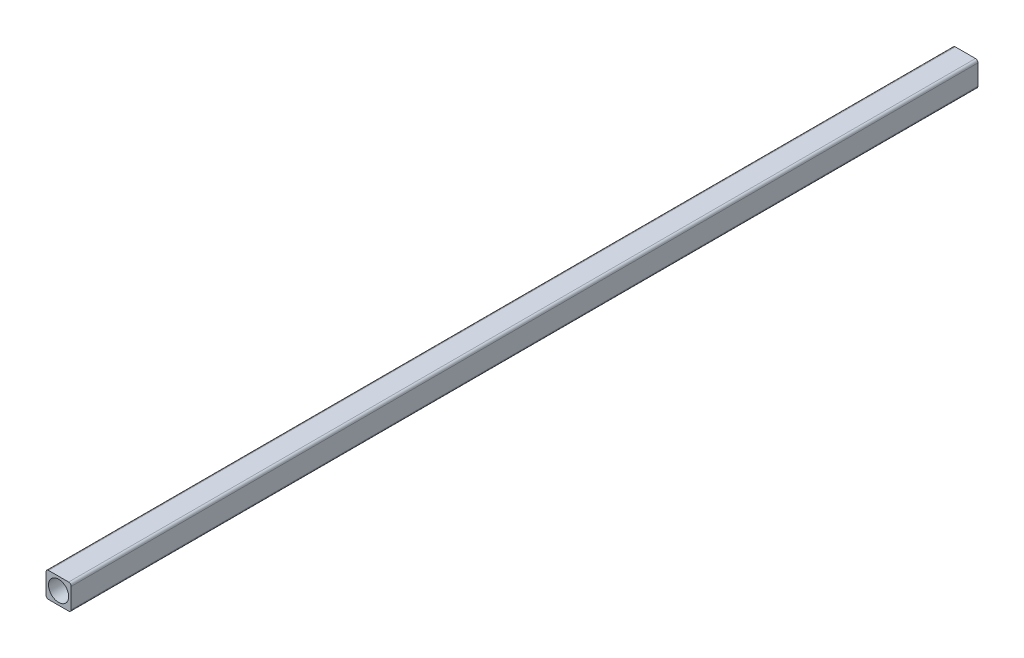
ISO-10303-21;
HEADER;
FILE_DESCRIPTION(('STEP AP214'),'2;1');
FILE_NAME('part.step','',(''),(''),'','','');
FILE_SCHEMA(('AUTOMOTIVE_DESIGN { 1 0 10303 214 1 1 1 1 }'));
ENDSEC;
DATA;
#1=APPLICATION_CONTEXT('core data for automotive mechanical design processes');
#2=APPLICATION_PROTOCOL_DEFINITION('international standard','automotive_design',2000,#1);
#3=PRODUCT_CONTEXT('',#1,'mechanical');
#4=PRODUCT('Part','Part','',(#3));
#5=PRODUCT_RELATED_PRODUCT_CATEGORY('part','',(#4));
#6=PRODUCT_DEFINITION_FORMATION('','',#4);
#7=PRODUCT_DEFINITION_CONTEXT('part definition',#1,'design');
#8=PRODUCT_DEFINITION('design','',#6,#7);
#9=PRODUCT_DEFINITION_SHAPE('','',#8);
#10=(LENGTH_UNIT() NAMED_UNIT(*) SI_UNIT(.MILLI.,.METRE.));
#11=(NAMED_UNIT(*) PLANE_ANGLE_UNIT() SI_UNIT($,.RADIAN.));
#12=(NAMED_UNIT(*) SI_UNIT($,.STERADIAN.) SOLID_ANGLE_UNIT());
#13=UNCERTAINTY_MEASURE_WITH_UNIT(LENGTH_MEASURE(1.E-05),#10,'distance_accuracy_value','');
#14=(GEOMETRIC_REPRESENTATION_CONTEXT(3) GLOBAL_UNCERTAINTY_ASSIGNED_CONTEXT((#13)) GLOBAL_UNIT_ASSIGNED_CONTEXT((#10,
#11,#12)) REPRESENTATION_CONTEXT('',''));
#15=CARTESIAN_POINT('',(0.,0.,0.));
#16=DIRECTION('',(0.,0.,1.));
#17=DIRECTION('',(1.,0.,0.));
#18=AXIS2_PLACEMENT_3D('',#15,#16,#17);
#19=CARTESIAN_POINT('',(-5.,5.,-180.));
#20=DIRECTION('',(-1.,0.,0.));
#21=DIRECTION('',(0.,0.,1.));
#22=AXIS2_PLACEMENT_3D('',#19,#20,#21);
#23=PLANE('',#22);
#24=DIRECTION('',(0.,-1.,0.));
#25=VECTOR('',#24,1.);
#26=CARTESIAN_POINT('',(-5.,5.,-180.));
#27=LINE('',#26,#25);
#28=CARTESIAN_POINT('',(-5.,4.,-180.));
#29=VERTEX_POINT('',#28);
#30=CARTESIAN_POINT('',(-5.,-4.,-180.));
#31=VERTEX_POINT('',#30);
#32=EDGE_CURVE('E169',#29,#31,#27,.T.);
#33=ORIENTED_EDGE('',*,*,#32,.T.);
#34=DIRECTION('',(0.,0.,1.));
#35=VECTOR('',#34,1.);
#36=CARTESIAN_POINT('',(-5.,-4.,-180.));
#37=LINE('',#36,#35);
#38=CARTESIAN_POINT('',(-5.,-4.,180.));
#39=VERTEX_POINT('',#38);
#40=EDGE_CURVE('E118',#31,#39,#37,.T.);
#41=ORIENTED_EDGE('',*,*,#40,.T.);
#42=DIRECTION('',(0.,-1.,0.));
#43=VECTOR('',#42,1.);
#44=CARTESIAN_POINT('',(-5.,5.,180.));
#45=LINE('',#44,#43);
#46=CARTESIAN_POINT('',(-5.,4.,180.));
#47=VERTEX_POINT('',#46);
#48=EDGE_CURVE('E103',#47,#39,#45,.T.);
#49=ORIENTED_EDGE('',*,*,#48,.F.);
#50=DIRECTION('',(0.,0.,1.));
#51=VECTOR('',#50,1.);
#52=CARTESIAN_POINT('',(-5.,4.,-180.));
#53=LINE('',#52,#51);
#54=EDGE_CURVE('E115',#47,#29,#53,.F.);
#55=ORIENTED_EDGE('',*,*,#54,.T.);
#56=EDGE_LOOP('',(#33,#41,#49,#55));
#57=FACE_BOUND('',#56,.T.);
#58=ADVANCED_FACE('F32',(#57),#23,.T.);
#59=CARTESIAN_POINT('',(5.,5.,-180.));
#60=DIRECTION('',(0.,1.,0.));
#61=DIRECTION('',(0.,0.,1.));
#62=AXIS2_PLACEMENT_3D('',#59,#60,#61);
#63=PLANE('',#62);
#64=DIRECTION('',(-1.,0.,0.));
#65=VECTOR('',#64,1.);
#66=CARTESIAN_POINT('',(5.,5.,-180.));
#67=LINE('',#66,#65);
#68=CARTESIAN_POINT('',(4.,5.,-180.));
#69=VERTEX_POINT('',#68);
#70=CARTESIAN_POINT('',(-4.,5.,-180.));
#71=VERTEX_POINT('',#70);
#72=EDGE_CURVE('E125',#69,#71,#67,.T.);
#73=ORIENTED_EDGE('',*,*,#72,.T.);
#74=DIRECTION('',(0.,0.,1.));
#75=VECTOR('',#74,1.);
#76=CARTESIAN_POINT('',(-4.,5.,-180.));
#77=LINE('',#76,#75);
#78=CARTESIAN_POINT('',(-4.,5.,180.));
#79=VERTEX_POINT('',#78);
#80=EDGE_CURVE('E11',#71,#79,#77,.T.);
#81=ORIENTED_EDGE('',*,*,#80,.T.);
#82=DIRECTION('',(-1.,0.,0.));
#83=VECTOR('',#82,1.);
#84=CARTESIAN_POINT('',(5.,5.,180.));
#85=LINE('',#84,#83);
#86=CARTESIAN_POINT('',(4.,5.,180.));
#87=VERTEX_POINT('',#86);
#88=EDGE_CURVE('E105',#87,#79,#85,.T.);
#89=ORIENTED_EDGE('',*,*,#88,.F.);
#90=DIRECTION('',(0.,0.,1.));
#91=VECTOR('',#90,1.);
#92=CARTESIAN_POINT('',(4.,5.,-180.));
#93=LINE('',#92,#91);
#94=EDGE_CURVE('E40',#87,#69,#93,.F.);
#95=ORIENTED_EDGE('',*,*,#94,.T.);
#96=EDGE_LOOP('',(#73,#81,#89,#95));
#97=FACE_BOUND('',#96,.T.);
#98=ADVANCED_FACE('F153',(#97),#63,.T.);
#99=CARTESIAN_POINT('',(5.,-5.,-180.));
#100=DIRECTION('',(1.,0.,0.));
#101=DIRECTION('',(0.,0.,-1.));
#102=AXIS2_PLACEMENT_3D('',#99,#100,#101);
#103=PLANE('',#102);
#104=DIRECTION('',(0.,1.,0.));
#105=VECTOR('',#104,1.);
#106=CARTESIAN_POINT('',(5.,-5.,180.));
#107=LINE('',#106,#105);
#108=CARTESIAN_POINT('',(5.,-4.,180.));
#109=VERTEX_POINT('',#108);
#110=CARTESIAN_POINT('',(5.,4.,180.));
#111=VERTEX_POINT('',#110);
#112=EDGE_CURVE('E160',#109,#111,#107,.T.);
#113=ORIENTED_EDGE('',*,*,#112,.F.);
#114=DIRECTION('',(0.,0.,1.));
#115=VECTOR('',#114,1.);
#116=CARTESIAN_POINT('',(5.,-4.,-180.));
#117=LINE('',#116,#115);
#118=CARTESIAN_POINT('',(5.,-4.,-180.));
#119=VERTEX_POINT('',#118);
#120=EDGE_CURVE('E54',#109,#119,#117,.F.);
#121=ORIENTED_EDGE('',*,*,#120,.T.);
#122=DIRECTION('',(0.,1.,0.));
#123=VECTOR('',#122,1.);
#124=CARTESIAN_POINT('',(5.,-5.,-180.));
#125=LINE('',#124,#123);
#126=CARTESIAN_POINT('',(5.,4.,-180.));
#127=VERTEX_POINT('',#126);
#128=EDGE_CURVE('E129',#119,#127,#125,.T.);
#129=ORIENTED_EDGE('',*,*,#128,.T.);
#130=DIRECTION('',(0.,0.,1.));
#131=VECTOR('',#130,1.);
#132=CARTESIAN_POINT('',(5.,4.,-180.));
#133=LINE('',#132,#131);
#134=EDGE_CURVE('E148',#127,#111,#133,.T.);
#135=ORIENTED_EDGE('',*,*,#134,.T.);
#136=EDGE_LOOP('',(#113,#121,#129,#135));
#137=FACE_BOUND('',#136,.T.);
#138=ADVANCED_FACE('F159',(#137),#103,.T.);
#139=CARTESIAN_POINT('',(-5.,-5.,-180.));
#140=DIRECTION('',(0.,-1.,0.));
#141=DIRECTION('',(1.,0.,0.));
#142=AXIS2_PLACEMENT_3D('',#139,#140,#141);
#143=PLANE('',#142);
#144=DIRECTION('',(1.,0.,0.));
#145=VECTOR('',#144,1.);
#146=CARTESIAN_POINT('',(-5.,-5.,180.));
#147=LINE('',#146,#145);
#148=CARTESIAN_POINT('',(-4.,-5.,180.));
#149=VERTEX_POINT('',#148);
#150=CARTESIAN_POINT('',(4.,-5.,180.));
#151=VERTEX_POINT('',#150);
#152=EDGE_CURVE('E119',#149,#151,#147,.T.);
#153=ORIENTED_EDGE('',*,*,#152,.F.);
#154=DIRECTION('',(0.,0.,1.));
#155=VECTOR('',#154,1.);
#156=CARTESIAN_POINT('',(-4.,-5.,-180.));
#157=LINE('',#156,#155);
#158=CARTESIAN_POINT('',(-4.,-5.,-180.));
#159=VERTEX_POINT('',#158);
#160=EDGE_CURVE('E140',#149,#159,#157,.F.);
#161=ORIENTED_EDGE('',*,*,#160,.T.);
#162=DIRECTION('',(1.,0.,0.));
#163=VECTOR('',#162,1.);
#164=CARTESIAN_POINT('',(-5.,-5.,-180.));
#165=LINE('',#164,#163);
#166=CARTESIAN_POINT('',(4.,-5.,-180.));
#167=VERTEX_POINT('',#166);
#168=EDGE_CURVE('E171',#159,#167,#165,.T.);
#169=ORIENTED_EDGE('',*,*,#168,.T.);
#170=DIRECTION('',(0.,0.,1.));
#171=VECTOR('',#170,1.);
#172=CARTESIAN_POINT('',(4.,-5.,-180.));
#173=LINE('',#172,#171);
#174=EDGE_CURVE('E137',#167,#151,#173,.T.);
#175=ORIENTED_EDGE('',*,*,#174,.T.);
#176=EDGE_LOOP('',(#153,#161,#169,#175));
#177=FACE_BOUND('',#176,.T.);
#178=ADVANCED_FACE('F176',(#177),#143,.T.);
#179=CARTESIAN_POINT('',(0.,0.,-180.));
#180=DIRECTION('',(0.,0.,1.));
#181=DIRECTION('',(1.,0.,0.));
#182=AXIS2_PLACEMENT_3D('',#179,#180,#181);
#183=PLANE('',#182);
#184=CARTESIAN_POINT('',(0.,0.,-180.));
#185=DIRECTION('',(0.,0.,1.));
#186=DIRECTION('',(1.,0.,0.));
#187=AXIS2_PLACEMENT_3D('',#184,#185,#186);
#188=CIRCLE('',#187,4.);
#189=CARTESIAN_POINT('',(4.,0.,-180.));
#190=VERTEX_POINT('',#189);
#191=EDGE_CURVE('E163',#190,#190,#188,.T.);
#192=ORIENTED_EDGE('',*,*,#191,.T.);
#193=EDGE_LOOP('',(#192));
#194=FACE_BOUND('',#193,.T.);
#195=ORIENTED_EDGE('',*,*,#168,.F.);
#196=CARTESIAN_POINT('',(-4.,-4.,-180.));
#197=DIRECTION('',(0.,0.,1.));
#198=DIRECTION('',(1.,0.,0.));
#199=AXIS2_PLACEMENT_3D('',#196,#197,#198);
#200=CIRCLE('',#199,1.);
#201=EDGE_CURVE('E146',#159,#31,#200,.F.);
#202=ORIENTED_EDGE('',*,*,#201,.T.);
#203=ORIENTED_EDGE('',*,*,#32,.F.);
#204=CARTESIAN_POINT('',(-4.,4.,-180.));
#205=DIRECTION('',(0.,0.,1.));
#206=DIRECTION('',(1.,0.,0.));
#207=AXIS2_PLACEMENT_3D('',#204,#205,#206);
#208=CIRCLE('',#207,1.);
#209=EDGE_CURVE('E124',#29,#71,#208,.F.);
#210=ORIENTED_EDGE('',*,*,#209,.T.);
#211=ORIENTED_EDGE('',*,*,#72,.F.);
#212=CARTESIAN_POINT('',(4.,4.,-180.));
#213=DIRECTION('',(0.,0.,1.));
#214=DIRECTION('',(1.,0.,0.));
#215=AXIS2_PLACEMENT_3D('',#212,#213,#214);
#216=CIRCLE('',#215,1.);
#217=EDGE_CURVE('E47',#69,#127,#216,.F.);
#218=ORIENTED_EDGE('',*,*,#217,.T.);
#219=ORIENTED_EDGE('',*,*,#128,.F.);
#220=CARTESIAN_POINT('',(4.,-4.,-180.));
#221=DIRECTION('',(0.,0.,1.));
#222=DIRECTION('',(1.,0.,0.));
#223=AXIS2_PLACEMENT_3D('',#220,#221,#222);
#224=CIRCLE('',#223,1.);
#225=EDGE_CURVE('E144',#119,#167,#224,.F.);
#226=ORIENTED_EDGE('',*,*,#225,.T.);
#227=EDGE_LOOP('',(#195,#202,#203,#210,#211,#218,#219,#226));
#228=FACE_BOUND('',#227,.T.);
#229=ADVANCED_FACE('F156',(#194,#228),#183,.F.);
#230=CARTESIAN_POINT('',(0.,0.,-180.));
#231=DIRECTION('',(0.,0.,1.));
#232=DIRECTION('',(1.,0.,0.));
#233=AXIS2_PLACEMENT_3D('',#230,#231,#232);
#234=CYLINDRICAL_SURFACE('',#233,4.);
#235=CARTESIAN_POINT('',(0.,0.,180.));
#236=DIRECTION('',(0.,0.,1.));
#237=DIRECTION('',(1.,0.,0.));
#238=AXIS2_PLACEMENT_3D('',#235,#236,#237);
#239=CIRCLE('',#238,4.);
#240=CARTESIAN_POINT('',(4.,0.,180.));
#241=VERTEX_POINT('',#240);
#242=EDGE_CURVE('E120',#241,#241,#239,.T.);
#243=CARTESIAN_POINT('',(4.,0.,-180.));
#244=CARTESIAN_POINT('',(4.,0.,-176.25));
#245=CARTESIAN_POINT('',(4.,0.,-172.5));
#246=CARTESIAN_POINT('',(4.,0.,-165.));
#247=CARTESIAN_POINT('',(4.,0.,-161.25));
#248=CARTESIAN_POINT('',(4.,0.,-153.75));
#249=CARTESIAN_POINT('',(4.,0.,-150.));
#250=CARTESIAN_POINT('',(4.,0.,-142.5));
#251=CARTESIAN_POINT('',(4.,0.,-138.75));
#252=CARTESIAN_POINT('',(4.,0.,-131.25));
#253=CARTESIAN_POINT('',(4.,0.,-127.5));
#254=CARTESIAN_POINT('',(4.,0.,-120.));
#255=CARTESIAN_POINT('',(4.,0.,-116.25));
#256=CARTESIAN_POINT('',(4.,0.,-108.75));
#257=CARTESIAN_POINT('',(4.,0.,-105.));
#258=CARTESIAN_POINT('',(4.,0.,-97.5));
#259=CARTESIAN_POINT('',(4.,0.,-93.75));
#260=CARTESIAN_POINT('',(4.,0.,-86.25));
#261=CARTESIAN_POINT('',(4.,0.,-82.5));
#262=CARTESIAN_POINT('',(4.,0.,-75.));
#263=CARTESIAN_POINT('',(4.,0.,-71.25));
#264=CARTESIAN_POINT('',(4.,0.,-63.75));
#265=CARTESIAN_POINT('',(4.,0.,-60.));
#266=CARTESIAN_POINT('',(4.,0.,-52.5));
#267=CARTESIAN_POINT('',(4.,0.,-48.75));
#268=CARTESIAN_POINT('',(4.,0.,-41.25));
#269=CARTESIAN_POINT('',(4.,0.,-37.5000000000001));
#270=CARTESIAN_POINT('',(4.,0.,-30.0000000000001));
#271=CARTESIAN_POINT('',(4.,0.,-26.25));
#272=CARTESIAN_POINT('',(4.,0.,-18.7500000000001));
#273=CARTESIAN_POINT('',(4.,0.,-15.0000000000001));
#274=CARTESIAN_POINT('',(4.,0.,-7.50000000000006));
#275=CARTESIAN_POINT('',(4.,0.,-3.75000000000006));
#276=CARTESIAN_POINT('',(4.,0.,3.74999999999995));
#277=CARTESIAN_POINT('',(4.,0.,7.49999999999995));
#278=CARTESIAN_POINT('',(4.,0.,14.9999999999999));
#279=CARTESIAN_POINT('',(4.,0.,18.7499999999999));
#280=CARTESIAN_POINT('',(4.,0.,26.2499999999999));
#281=CARTESIAN_POINT('',(4.,0.,29.9999999999999));
#282=CARTESIAN_POINT('',(4.,0.,37.4999999999999));
#283=CARTESIAN_POINT('',(4.,0.,41.2499999999999));
#284=CARTESIAN_POINT('',(4.,0.,48.7499999999999));
#285=CARTESIAN_POINT('',(4.,0.,52.4999999999999));
#286=CARTESIAN_POINT('',(4.,0.,59.9999999999999));
#287=CARTESIAN_POINT('',(4.,0.,63.7499999999999));
#288=CARTESIAN_POINT('',(4.,0.,71.2499999999999));
#289=CARTESIAN_POINT('',(4.,0.,74.9999999999999));
#290=CARTESIAN_POINT('',(4.,0.,82.4999999999999));
#291=CARTESIAN_POINT('',(4.,0.,86.25));
#292=CARTESIAN_POINT('',(4.,0.,93.75));
#293=CARTESIAN_POINT('',(4.,0.,97.5));
#294=CARTESIAN_POINT('',(4.,0.,105.));
#295=CARTESIAN_POINT('',(4.,0.,108.75));
#296=CARTESIAN_POINT('',(4.,0.,116.25));
#297=CARTESIAN_POINT('',(4.,0.,120.));
#298=CARTESIAN_POINT('',(4.,0.,127.5));
#299=CARTESIAN_POINT('',(4.,0.,131.25));
#300=CARTESIAN_POINT('',(4.,0.,138.75));
#301=CARTESIAN_POINT('',(4.,0.,142.5));
#302=CARTESIAN_POINT('',(4.,0.,150.));
#303=CARTESIAN_POINT('',(4.,0.,153.75));
#304=CARTESIAN_POINT('',(4.,0.,161.25));
#305=CARTESIAN_POINT('',(4.,0.,165.));
#306=CARTESIAN_POINT('',(4.,0.,172.5));
#307=CARTESIAN_POINT('',(4.,0.,176.25));
#308=CARTESIAN_POINT('',(4.,0.,180.));
#309=B_SPLINE_CURVE_WITH_KNOTS('',3,(#243,#244,#245,#246,#247,#248,#249,#250,#251,#252,#253,
#254,#255,#256,#257,#258,#259,#260,#261,#262,#263,#264,#265,#266,#267,#268,#269,#270,#271,#272,
#273,#274,#275,#276,#277,#278,#279,#280,#281,#282,#283,#284,#285,#286,#287,#288,#289,#290,#291,
#292,#293,#294,#295,#296,#297,#298,#299,#300,#301,#302,#303,#304,#305,#306,#307,#308),
.UNSPECIFIED.,.F.,.F.,(4,2,2,2,2,2,2,2,2,2,2,2,2,2,2,2,2,2,2,2,2,2,2,2,2,2,2,2,2,2,2,2,4),(0.,
11.25,22.5,33.75,45.,56.25,67.5,78.75,90.,101.25,112.5,123.75,135.,146.25,157.5,168.75,180.,
191.25,202.5,213.75,225.,236.25,247.5,258.75,270.,281.25,292.5,303.75,315.,326.25,337.5,348.75,
360.),.UNSPECIFIED.);
#310=EDGE_CURVE('BSEAM204',#190,#241,#309,.T.);
#311=ORIENTED_EDGE('',*,*,#191,.F.);
#312=ORIENTED_EDGE('',*,*,#242,.T.);
#313=ORIENTED_EDGE('',*,*,#310,.T.);
#314=ORIENTED_EDGE('',*,*,#310,.F.);
#315=EDGE_LOOP('',(#311,#313,#312,#314));
#316=FACE_BOUND('',#315,.T.);
#317=ADVANCED_FACE('F204',(#316),#234,.F.);
#318=CARTESIAN_POINT('',(0.,0.,180.));
#319=DIRECTION('',(0.,0.,1.));
#320=DIRECTION('',(1.,0.,0.));
#321=AXIS2_PLACEMENT_3D('',#318,#319,#320);
#322=PLANE('',#321);
#323=ORIENTED_EDGE('',*,*,#48,.T.);
#324=CARTESIAN_POINT('',(-4.,-4.,180.));
#325=DIRECTION('',(0.,0.,1.));
#326=DIRECTION('',(1.,0.,0.));
#327=AXIS2_PLACEMENT_3D('',#324,#325,#326);
#328=CIRCLE('',#327,1.);
#329=EDGE_CURVE('E135',#39,#149,#328,.T.);
#330=ORIENTED_EDGE('',*,*,#329,.T.);
#331=ORIENTED_EDGE('',*,*,#152,.T.);
#332=CARTESIAN_POINT('',(4.,-4.,180.));
#333=DIRECTION('',(0.,0.,1.));
#334=DIRECTION('',(1.,0.,0.));
#335=AXIS2_PLACEMENT_3D('',#332,#333,#334);
#336=CIRCLE('',#335,1.);
#337=EDGE_CURVE('E109',#151,#109,#336,.T.);
#338=ORIENTED_EDGE('',*,*,#337,.T.);
#339=ORIENTED_EDGE('',*,*,#112,.T.);
#340=CARTESIAN_POINT('',(4.,4.,180.));
#341=DIRECTION('',(0.,0.,1.));
#342=DIRECTION('',(1.,0.,0.));
#343=AXIS2_PLACEMENT_3D('',#340,#341,#342);
#344=CIRCLE('',#343,1.);
#345=EDGE_CURVE('E110',#111,#87,#344,.T.);
#346=ORIENTED_EDGE('',*,*,#345,.T.);
#347=ORIENTED_EDGE('',*,*,#88,.T.);
#348=CARTESIAN_POINT('',(-4.,4.,180.));
#349=DIRECTION('',(0.,0.,1.));
#350=DIRECTION('',(1.,0.,0.));
#351=AXIS2_PLACEMENT_3D('',#348,#349,#350);
#352=CIRCLE('',#351,1.);
#353=EDGE_CURVE('E99',#79,#47,#352,.T.);
#354=ORIENTED_EDGE('',*,*,#353,.T.);
#355=EDGE_LOOP('',(#323,#330,#331,#338,#339,#346,#347,#354));
#356=FACE_BOUND('',#355,.T.);
#357=ORIENTED_EDGE('',*,*,#242,.F.);
#358=EDGE_LOOP('',(#357));
#359=FACE_BOUND('',#358,.T.);
#360=ADVANCED_FACE('F101',(#356,#359),#322,.T.);
#361=CARTESIAN_POINT('',(-4.,-4.,-180.));
#362=DIRECTION('',(0.,0.,1.));
#363=DIRECTION('',(1.,0.,0.));
#364=AXIS2_PLACEMENT_3D('',#361,#362,#363);
#365=CYLINDRICAL_SURFACE('',#364,1.);
#366=ORIENTED_EDGE('',*,*,#201,.F.);
#367=ORIENTED_EDGE('',*,*,#160,.F.);
#368=ORIENTED_EDGE('',*,*,#329,.F.);
#369=ORIENTED_EDGE('',*,*,#40,.F.);
#370=EDGE_LOOP('',(#366,#367,#368,#369));
#371=FACE_BOUND('',#370,.T.);
#372=ADVANCED_FACE('F183',(#371),#365,.T.);
#373=CARTESIAN_POINT('',(4.,-4.,-180.));
#374=DIRECTION('',(0.,0.,1.));
#375=DIRECTION('',(1.,0.,0.));
#376=AXIS2_PLACEMENT_3D('',#373,#374,#375);
#377=CYLINDRICAL_SURFACE('',#376,1.);
#378=ORIENTED_EDGE('',*,*,#225,.F.);
#379=ORIENTED_EDGE('',*,*,#120,.F.);
#380=ORIENTED_EDGE('',*,*,#337,.F.);
#381=ORIENTED_EDGE('',*,*,#174,.F.);
#382=EDGE_LOOP('',(#378,#379,#380,#381));
#383=FACE_BOUND('',#382,.T.);
#384=ADVANCED_FACE('F181',(#383),#377,.T.);
#385=CARTESIAN_POINT('',(-4.,4.,-180.));
#386=DIRECTION('',(0.,0.,1.));
#387=DIRECTION('',(1.,0.,0.));
#388=AXIS2_PLACEMENT_3D('',#385,#386,#387);
#389=CYLINDRICAL_SURFACE('',#388,1.);
#390=ORIENTED_EDGE('',*,*,#209,.F.);
#391=ORIENTED_EDGE('',*,*,#54,.F.);
#392=ORIENTED_EDGE('',*,*,#353,.F.);
#393=ORIENTED_EDGE('',*,*,#80,.F.);
#394=EDGE_LOOP('',(#390,#391,#392,#393));
#395=FACE_BOUND('',#394,.T.);
#396=ADVANCED_FACE('F123',(#395),#389,.T.);
#397=CARTESIAN_POINT('',(4.,4.,-180.));
#398=DIRECTION('',(0.,0.,1.));
#399=DIRECTION('',(1.,0.,0.));
#400=AXIS2_PLACEMENT_3D('',#397,#398,#399);
#401=CYLINDRICAL_SURFACE('',#400,1.);
#402=ORIENTED_EDGE('',*,*,#217,.F.);
#403=ORIENTED_EDGE('',*,*,#94,.F.);
#404=ORIENTED_EDGE('',*,*,#345,.F.);
#405=ORIENTED_EDGE('',*,*,#134,.F.);
#406=EDGE_LOOP('',(#402,#403,#404,#405));
#407=FACE_BOUND('',#406,.T.);
#408=ADVANCED_FACE('F34',(#407),#401,.T.);
#409=CLOSED_SHELL('',(#58,#98,#138,#178,#229,#317,#360,#372,#384,#396,#408));
#410=MANIFOLD_SOLID_BREP('B2',#409);
#411=ADVANCED_BREP_SHAPE_REPRESENTATION('',(#18,#410),#14);
#412=SHAPE_DEFINITION_REPRESENTATION(#9,#411);
ENDSEC;
END-ISO-10303-21;
